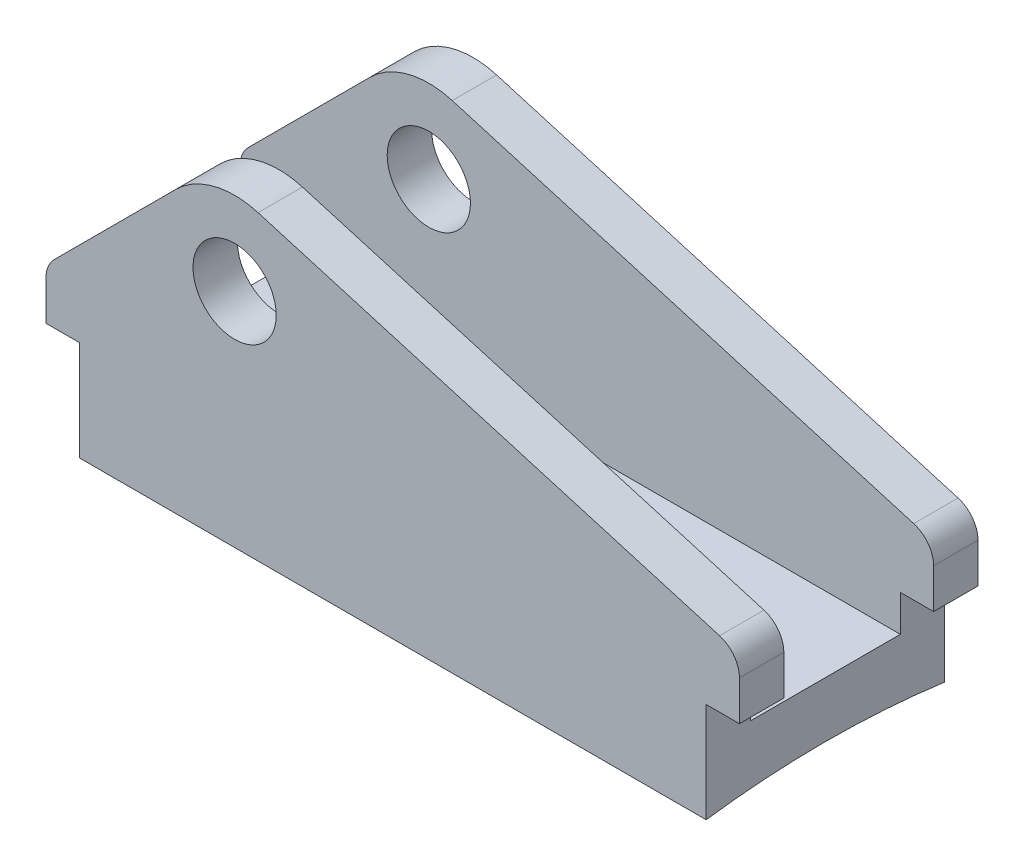
ISO-10303-21;
HEADER;
FILE_DESCRIPTION(('STEP AP214'),'2;1');
FILE_NAME('part.step','',(''),(''),'','','');
FILE_SCHEMA(('AUTOMOTIVE_DESIGN { 1 0 10303 214 1 1 1 1 }'));
ENDSEC;
DATA;
#1=APPLICATION_CONTEXT('core data for automotive mechanical design processes');
#2=APPLICATION_PROTOCOL_DEFINITION('international standard','automotive_design',2000,#1);
#3=PRODUCT_CONTEXT('',#1,'mechanical');
#4=PRODUCT('Part','Part','',(#3));
#5=PRODUCT_RELATED_PRODUCT_CATEGORY('part','',(#4));
#6=PRODUCT_DEFINITION_FORMATION('','',#4);
#7=PRODUCT_DEFINITION_CONTEXT('part definition',#1,'design');
#8=PRODUCT_DEFINITION('design','',#6,#7);
#9=PRODUCT_DEFINITION_SHAPE('','',#8);
#10=(LENGTH_UNIT() NAMED_UNIT(*) SI_UNIT(.MILLI.,.METRE.));
#11=(NAMED_UNIT(*) PLANE_ANGLE_UNIT() SI_UNIT($,.RADIAN.));
#12=(NAMED_UNIT(*) SI_UNIT($,.STERADIAN.) SOLID_ANGLE_UNIT());
#13=UNCERTAINTY_MEASURE_WITH_UNIT(LENGTH_MEASURE(1.E-05),#10,'distance_accuracy_value','');
#14=(GEOMETRIC_REPRESENTATION_CONTEXT(3) GLOBAL_UNCERTAINTY_ASSIGNED_CONTEXT((#13)) GLOBAL_UNIT_ASSIGNED_CONTEXT((#10,
#11,#12)) REPRESENTATION_CONTEXT('',''));
#15=CARTESIAN_POINT('',(0.,0.,0.));
#16=DIRECTION('',(0.,0.,1.));
#17=DIRECTION('',(1.,0.,0.));
#18=AXIS2_PLACEMENT_3D('',#15,#16,#17);
#19=CARTESIAN_POINT('',(56.5,176.548888359395,21.5));
#20=DIRECTION('',(0.,1.,0.));
#21=DIRECTION('',(-1.,0.,0.));
#22=AXIS2_PLACEMENT_3D('',#19,#20,#21);
#23=PLANE('',#22);
#24=DIRECTION('',(0.,0.,-1.));
#25=VECTOR('',#24,1.);
#26=CARTESIAN_POINT('',(62.5,176.548888359395,21.5));
#27=LINE('',#26,#25);
#28=CARTESIAN_POINT('',(62.5,176.548888359395,-13.5));
#29=VERTEX_POINT('',#28);
#30=CARTESIAN_POINT('',(62.5,176.548888359395,-21.5));
#31=VERTEX_POINT('',#30);
#32=EDGE_CURVE('E226',#29,#31,#27,.T.);
#33=ORIENTED_EDGE('',*,*,#32,.F.);
#34=DIRECTION('',(-1.,0.,0.));
#35=VECTOR('',#34,1.);
#36=CARTESIAN_POINT('',(56.5,176.548888359395,-13.5));
#37=LINE('',#36,#35);
#38=CARTESIAN_POINT('',(56.5,176.548888359395,-13.5));
#39=VERTEX_POINT('',#38);
#40=EDGE_CURVE('E266',#29,#39,#37,.T.);
#41=ORIENTED_EDGE('',*,*,#40,.T.);
#42=DIRECTION('',(0.,0.,-1.));
#43=VECTOR('',#42,1.);
#44=CARTESIAN_POINT('',(56.5,176.548888359395,21.5));
#45=LINE('',#44,#43);
#46=CARTESIAN_POINT('',(56.5,176.548888359395,-21.5));
#47=VERTEX_POINT('',#46);
#48=EDGE_CURVE('E229',#39,#47,#45,.T.);
#49=ORIENTED_EDGE('',*,*,#48,.T.);
#50=DIRECTION('',(1.,0.,0.));
#51=VECTOR('',#50,1.);
#52=CARTESIAN_POINT('',(56.5,176.548888359395,-21.5));
#53=LINE('',#52,#51);
#54=EDGE_CURVE('E177',#47,#31,#53,.T.);
#55=ORIENTED_EDGE('',*,*,#54,.T.);
#56=EDGE_LOOP('',(#33,#41,#49,#55));
#57=FACE_BOUND('',#56,.T.);
#58=ADVANCED_FACE('F39',(#57),#23,.F.);
#59=CARTESIAN_POINT('',(62.5,176.548888359395,21.5));
#60=DIRECTION('',(-1.,0.,0.));
#61=DIRECTION('',(0.,-1.,0.));
#62=AXIS2_PLACEMENT_3D('',#59,#60,#61);
#63=PLANE('',#62);
#64=DIRECTION('',(0.,0.,-1.));
#65=VECTOR('',#64,1.);
#66=CARTESIAN_POINT('',(62.5,183.691023983127,21.5));
#67=LINE('',#66,#65);
#68=CARTESIAN_POINT('',(62.5,183.691023983127,-13.5));
#69=VERTEX_POINT('',#68);
#70=CARTESIAN_POINT('',(62.5,183.691023983127,-21.5));
#71=VERTEX_POINT('',#70);
#72=EDGE_CURVE('E225',#69,#71,#67,.T.);
#73=ORIENTED_EDGE('',*,*,#72,.F.);
#74=DIRECTION('',(0.,-1.,0.));
#75=VECTOR('',#74,1.);
#76=CARTESIAN_POINT('',(62.5,176.548888359395,-13.5));
#77=LINE('',#76,#75);
#78=EDGE_CURVE('E366',#69,#29,#77,.T.);
#79=ORIENTED_EDGE('',*,*,#78,.T.);
#80=ORIENTED_EDGE('',*,*,#32,.T.);
#81=DIRECTION('',(0.,1.,0.));
#82=VECTOR('',#81,1.);
#83=CARTESIAN_POINT('',(62.5,176.548888359395,-21.5));
#84=LINE('',#83,#82);
#85=EDGE_CURVE('E176',#31,#71,#84,.T.);
#86=ORIENTED_EDGE('',*,*,#85,.T.);
#87=EDGE_LOOP('',(#73,#79,#80,#86));
#88=FACE_BOUND('',#87,.T.);
#89=ADVANCED_FACE('F381',(#88),#63,.F.);
#90=CARTESIAN_POINT('',(57.5,183.691023983127,21.5));
#91=DIRECTION('',(0.,0.,-1.));
#92=DIRECTION('',(-1.,0.,0.));
#93=AXIS2_PLACEMENT_3D('',#90,#91,#92);
#94=CYLINDRICAL_SURFACE('',#93,5.00000000000001);
#95=DIRECTION('',(0.,0.,-1.));
#96=VECTOR('',#95,1.);
#97=CARTESIAN_POINT('',(58.9101576401027,188.488049668909,21.5));
#98=LINE('',#97,#96);
#99=CARTESIAN_POINT('',(58.9101576401027,188.488049668909,-13.5));
#100=VERTEX_POINT('',#99);
#101=CARTESIAN_POINT('',(58.9101576401027,188.488049668909,-21.5));
#102=VERTEX_POINT('',#101);
#103=EDGE_CURVE('E217',#100,#102,#98,.T.);
#104=ORIENTED_EDGE('',*,*,#103,.F.);
#105=CARTESIAN_POINT('',(57.5,183.691023983127,-13.5));
#106=DIRECTION('',(0.,0.,-1.));
#107=DIRECTION('',(-1.,0.,0.));
#108=AXIS2_PLACEMENT_3D('',#105,#106,#107);
#109=CIRCLE('',#108,5.00000000000001);
#110=EDGE_CURVE('E371',#100,#69,#109,.T.);
#111=ORIENTED_EDGE('',*,*,#110,.T.);
#112=ORIENTED_EDGE('',*,*,#72,.T.);
#113=CARTESIAN_POINT('',(57.5,183.691023983127,-21.5));
#114=DIRECTION('',(0.,0.,1.));
#115=DIRECTION('',(1.,0.,0.));
#116=AXIS2_PLACEMENT_3D('',#113,#114,#115);
#117=CIRCLE('',#116,5.00000000000001);
#118=EDGE_CURVE('E185',#71,#102,#117,.T.);
#119=ORIENTED_EDGE('',*,*,#118,.T.);
#120=EDGE_LOOP('',(#104,#111,#112,#119));
#121=FACE_BOUND('',#120,.T.);
#122=ADVANCED_FACE('F378',(#121),#94,.T.);
#123=CARTESIAN_POINT('',(58.9101576401027,188.488049668909,21.5));
#124=DIRECTION('',(-0.282031528020554,-0.959405137156557,0.));
#125=DIRECTION('',(0.959405137156557,-0.282031528020554,0.));
#126=AXIS2_PLACEMENT_3D('',#123,#124,#125);
#127=PLANE('',#126);
#128=DIRECTION('',(0.,0.,-1.));
#129=VECTOR('',#128,1.);
#130=CARTESIAN_POINT('',(-24.2695270796917,212.939965416744,21.5));
#131=LINE('',#130,#129);
#132=CARTESIAN_POINT('',(-24.2695270796917,212.939965416744,-13.5));
#133=VERTEX_POINT('',#132);
#134=CARTESIAN_POINT('',(-24.2695270796917,212.939965416744,-21.5));
#135=VERTEX_POINT('',#134);
#136=EDGE_CURVE('E212',#133,#135,#131,.T.);
#137=ORIENTED_EDGE('',*,*,#136,.F.);
#138=DIRECTION('',(0.959405137156557,-0.282031528020554,0.));
#139=VECTOR('',#138,1.);
#140=CARTESIAN_POINT('',(58.9101576401027,188.488049668909,-13.5));
#141=LINE('',#140,#139);
#142=EDGE_CURVE('E377',#133,#100,#141,.T.);
#143=ORIENTED_EDGE('',*,*,#142,.T.);
#144=ORIENTED_EDGE('',*,*,#103,.T.);
#145=DIRECTION('',(-0.959405137156557,0.282031528020554,0.));
#146=VECTOR('',#145,1.);
#147=CARTESIAN_POINT('',(58.9101576401027,188.488049668909,-21.5));
#148=LINE('',#147,#146);
#149=EDGE_CURVE('E183',#102,#135,#148,.T.);
#150=ORIENTED_EDGE('',*,*,#149,.T.);
#151=EDGE_LOOP('',(#137,#143,#144,#150));
#152=FACE_BOUND('',#151,.T.);
#153=ADVANCED_FACE('F390',(#152),#127,.F.);
#154=CARTESIAN_POINT('',(-28.5,198.548888359395,21.5));
#155=DIRECTION('',(0.,0.,-1.));
#156=DIRECTION('',(-1.,0.,0.));
#157=AXIS2_PLACEMENT_3D('',#154,#155,#156);
#158=CYLINDRICAL_SURFACE('',#157,15.);
#159=DIRECTION('',(0.,0.,-1.));
#160=VECTOR('',#159,1.);
#161=CARTESIAN_POINT('',(-39.1066017177982,209.155490077194,21.5));
#162=LINE('',#161,#160);
#163=CARTESIAN_POINT('',(-39.1066017177982,209.155490077194,-13.5));
#164=VERTEX_POINT('',#163);
#165=CARTESIAN_POINT('',(-39.1066017177982,209.155490077194,-21.5));
#166=VERTEX_POINT('',#165);
#167=EDGE_CURVE('E209',#164,#166,#162,.T.);
#168=ORIENTED_EDGE('',*,*,#167,.F.);
#169=CARTESIAN_POINT('',(-28.5,198.548888359395,-13.5));
#170=DIRECTION('',(0.,0.,-1.));
#171=DIRECTION('',(-1.,0.,0.));
#172=AXIS2_PLACEMENT_3D('',#169,#170,#171);
#173=CIRCLE('',#172,15.);
#174=EDGE_CURVE('E386',#164,#133,#173,.T.);
#175=ORIENTED_EDGE('',*,*,#174,.T.);
#176=ORIENTED_EDGE('',*,*,#136,.T.);
#177=CARTESIAN_POINT('',(-28.5,198.548888359395,-21.5));
#178=DIRECTION('',(0.,0.,1.));
#179=DIRECTION('',(1.,0.,0.));
#180=AXIS2_PLACEMENT_3D('',#177,#178,#179);
#181=CIRCLE('',#180,15.);
#182=EDGE_CURVE('E187',#135,#166,#181,.T.);
#183=ORIENTED_EDGE('',*,*,#182,.T.);
#184=EDGE_LOOP('',(#168,#175,#176,#183));
#185=FACE_BOUND('',#184,.T.);
#186=ADVANCED_FACE('F470',(#185),#158,.T.);
#187=CARTESIAN_POINT('',(-39.1066017177982,209.155490077194,21.5));
#188=DIRECTION('',(0.707106781186544,-0.707106781186551,0.));
#189=DIRECTION('',(0.707106781186551,0.707106781186544,0.));
#190=AXIS2_PLACEMENT_3D('',#187,#188,#189);
#191=PLANE('',#190);
#192=DIRECTION('',(0.,0.,-1.));
#193=VECTOR('',#192,1.);
#194=CARTESIAN_POINT('',(-61.0355339059328,187.226557889059,21.5));
#195=LINE('',#194,#193);
#196=CARTESIAN_POINT('',(-61.0355339059328,187.226557889059,-13.5));
#197=VERTEX_POINT('',#196);
#198=CARTESIAN_POINT('',(-61.0355339059328,187.226557889059,-21.5));
#199=VERTEX_POINT('',#198);
#200=EDGE_CURVE('E158',#197,#199,#195,.T.);
#201=ORIENTED_EDGE('',*,*,#200,.F.);
#202=DIRECTION('',(0.707106781186551,0.707106781186544,0.));
#203=VECTOR('',#202,1.);
#204=CARTESIAN_POINT('',(-39.1066017177982,209.155490077194,-13.5));
#205=LINE('',#204,#203);
#206=EDGE_CURVE('E391',#197,#164,#205,.T.);
#207=ORIENTED_EDGE('',*,*,#206,.T.);
#208=ORIENTED_EDGE('',*,*,#167,.T.);
#209=DIRECTION('',(-0.707106781186551,-0.707106781186544,0.));
#210=VECTOR('',#209,1.);
#211=CARTESIAN_POINT('',(-39.1066017177982,209.155490077194,-21.5));
#212=LINE('',#211,#210);
#213=EDGE_CURVE('E192',#166,#199,#212,.T.);
#214=ORIENTED_EDGE('',*,*,#213,.T.);
#215=EDGE_LOOP('',(#201,#207,#208,#214));
#216=FACE_BOUND('',#215,.T.);
#217=ADVANCED_FACE('F467',(#216),#191,.F.);
#218=CARTESIAN_POINT('',(-57.5,183.691023983127,21.5));
#219=DIRECTION('',(0.,0.,-1.));
#220=DIRECTION('',(-1.,0.,0.));
#221=AXIS2_PLACEMENT_3D('',#218,#219,#220);
#222=CYLINDRICAL_SURFACE('',#221,4.99999999999999);
#223=DIRECTION('',(0.,0.,-1.));
#224=VECTOR('',#223,1.);
#225=CARTESIAN_POINT('',(-62.5,183.691023983127,21.5));
#226=LINE('',#225,#224);
#227=CARTESIAN_POINT('',(-62.5,183.691023983127,-13.5));
#228=VERTEX_POINT('',#227);
#229=CARTESIAN_POINT('',(-62.5,183.691023983127,-21.5));
#230=VERTEX_POINT('',#229);
#231=EDGE_CURVE('E157',#228,#230,#226,.T.);
#232=ORIENTED_EDGE('',*,*,#231,.F.);
#233=CARTESIAN_POINT('',(-57.5,183.691023983127,-13.5));
#234=DIRECTION('',(0.,0.,-1.));
#235=DIRECTION('',(-1.,0.,0.));
#236=AXIS2_PLACEMENT_3D('',#233,#234,#235);
#237=CIRCLE('',#236,4.99999999999999);
#238=EDGE_CURVE('E458',#228,#197,#237,.T.);
#239=ORIENTED_EDGE('',*,*,#238,.T.);
#240=ORIENTED_EDGE('',*,*,#200,.T.);
#241=CARTESIAN_POINT('',(-57.5,183.691023983127,-21.5));
#242=DIRECTION('',(0.,0.,1.));
#243=DIRECTION('',(1.,0.,0.));
#244=AXIS2_PLACEMENT_3D('',#241,#242,#243);
#245=CIRCLE('',#244,4.99999999999999);
#246=EDGE_CURVE('E191',#199,#230,#245,.T.);
#247=ORIENTED_EDGE('',*,*,#246,.T.);
#248=EDGE_LOOP('',(#232,#239,#240,#247));
#249=FACE_BOUND('',#248,.T.);
#250=ADVANCED_FACE('F475',(#249),#222,.T.);
#251=CARTESIAN_POINT('',(-62.5,183.691023983127,21.5));
#252=DIRECTION('',(1.,0.,0.));
#253=DIRECTION('',(0.,0.,-1.));
#254=AXIS2_PLACEMENT_3D('',#251,#252,#253);
#255=PLANE('',#254);
#256=DIRECTION('',(0.,0.,-1.));
#257=VECTOR('',#256,1.);
#258=CARTESIAN_POINT('',(-62.5,176.548888359395,21.5));
#259=LINE('',#258,#257);
#260=CARTESIAN_POINT('',(-62.5,176.548888359395,-13.5));
#261=VERTEX_POINT('',#260);
#262=CARTESIAN_POINT('',(-62.5,176.548888359395,-21.5));
#263=VERTEX_POINT('',#262);
#264=EDGE_CURVE('E206',#261,#263,#259,.T.);
#265=ORIENTED_EDGE('',*,*,#264,.F.);
#266=DIRECTION('',(0.,1.,0.));
#267=VECTOR('',#266,1.);
#268=CARTESIAN_POINT('',(-62.5,183.691023983127,-13.5));
#269=LINE('',#268,#267);
#270=EDGE_CURVE('E460',#261,#228,#269,.T.);
#271=ORIENTED_EDGE('',*,*,#270,.T.);
#272=ORIENTED_EDGE('',*,*,#231,.T.);
#273=DIRECTION('',(0.,-1.,0.));
#274=VECTOR('',#273,1.);
#275=CARTESIAN_POINT('',(-62.5,183.691023983127,-21.5));
#276=LINE('',#275,#274);
#277=EDGE_CURVE('E197',#230,#263,#276,.T.);
#278=ORIENTED_EDGE('',*,*,#277,.T.);
#279=EDGE_LOOP('',(#265,#271,#272,#278));
#280=FACE_BOUND('',#279,.T.);
#281=ADVANCED_FACE('F413',(#280),#255,.F.);
#282=CARTESIAN_POINT('',(-62.5,176.548888359395,21.5));
#283=DIRECTION('',(0.,1.,0.));
#284=DIRECTION('',(0.,0.,1.));
#285=AXIS2_PLACEMENT_3D('',#282,#283,#284);
#286=PLANE('',#285);
#287=DIRECTION('',(0.,0.,-1.));
#288=VECTOR('',#287,1.);
#289=CARTESIAN_POINT('',(-56.5,176.548888359395,21.5));
#290=LINE('',#289,#288);
#291=CARTESIAN_POINT('',(-56.5,176.548888359395,-13.5));
#292=VERTEX_POINT('',#291);
#293=CARTESIAN_POINT('',(-56.5,176.548888359395,-21.5));
#294=VERTEX_POINT('',#293);
#295=EDGE_CURVE('E106',#292,#294,#290,.T.);
#296=ORIENTED_EDGE('',*,*,#295,.F.);
#297=DIRECTION('',(-1.,0.,0.));
#298=VECTOR('',#297,1.);
#299=CARTESIAN_POINT('',(-62.5,176.548888359395,-13.5));
#300=LINE('',#299,#298);
#301=EDGE_CURVE('E241',#292,#261,#300,.T.);
#302=ORIENTED_EDGE('',*,*,#301,.T.);
#303=ORIENTED_EDGE('',*,*,#264,.T.);
#304=DIRECTION('',(1.,0.,0.));
#305=VECTOR('',#304,1.);
#306=CARTESIAN_POINT('',(-62.5,176.548888359395,-21.5));
#307=LINE('',#306,#305);
#308=EDGE_CURVE('E199',#263,#294,#307,.T.);
#309=ORIENTED_EDGE('',*,*,#308,.T.);
#310=EDGE_LOOP('',(#296,#302,#303,#309));
#311=FACE_BOUND('',#310,.T.);
#312=ADVANCED_FACE('F406',(#311),#286,.F.);
#313=CARTESIAN_POINT('',(-28.5,198.548888359395,21.5));
#314=DIRECTION('',(0.,0.,-1.));
#315=DIRECTION('',(-1.,0.,0.));
#316=AXIS2_PLACEMENT_3D('',#313,#314,#315);
#317=CYLINDRICAL_SURFACE('',#316,7.50000000000001);
#318=CARTESIAN_POINT('',(-28.5,198.548888359395,-13.5));
#319=DIRECTION('',(0.,0.,-1.));
#320=DIRECTION('',(-1.,0.,0.));
#321=AXIS2_PLACEMENT_3D('',#318,#319,#320);
#322=CIRCLE('',#321,7.50000000000001);
#323=CARTESIAN_POINT('',(-36.0000000000001,198.548888359395,-13.5));
#324=VERTEX_POINT('',#323);
#325=EDGE_CURVE('E239',#324,#324,#322,.T.);
#326=ORIENTED_EDGE('',*,*,#325,.F.);
#327=EDGE_LOOP('',(#326));
#328=FACE_BOUND('',#327,.T.);
#329=CARTESIAN_POINT('',(-28.5,198.548888359395,-21.5));
#330=DIRECTION('',(0.,0.,1.));
#331=DIRECTION('',(1.,0.,0.));
#332=AXIS2_PLACEMENT_3D('',#329,#330,#331);
#333=CIRCLE('',#332,7.50000000000001);
#334=CARTESIAN_POINT('',(-21.,198.548888359395,-21.5));
#335=VERTEX_POINT('',#334);
#336=EDGE_CURVE('E292',#335,#335,#333,.T.);
#337=ORIENTED_EDGE('',*,*,#336,.F.);
#338=EDGE_LOOP('',(#337));
#339=FACE_BOUND('',#338,.T.);
#340=ADVANCED_FACE('F404',(#328,#339),#317,.F.);
#341=CARTESIAN_POINT('',(57.5,183.691023983127,21.5));
#342=DIRECTION('',(0.,0.,1.));
#343=DIRECTION('',(1.,0.,0.));
#344=AXIS2_PLACEMENT_3D('',#341,#342,#343);
#345=PLANE('',#344);
#346=DIRECTION('',(0.,-1.,0.));
#347=VECTOR('',#346,1.);
#348=CARTESIAN_POINT('',(-56.5,176.548888359395,21.5));
#349=LINE('',#348,#347);
#350=CARTESIAN_POINT('',(-56.5,176.548888359395,21.5));
#351=VERTEX_POINT('',#350);
#352=CARTESIAN_POINT('',(-56.5,158.548888359395,21.5));
#353=VERTEX_POINT('',#352);
#354=EDGE_CURVE('E205',#351,#353,#349,.T.);
#355=ORIENTED_EDGE('',*,*,#354,.T.);
#356=DIRECTION('',(1.,0.,0.));
#357=VECTOR('',#356,1.);
#358=CARTESIAN_POINT('',(-56.5,158.548888359395,21.5));
#359=LINE('',#358,#357);
#360=CARTESIAN_POINT('',(56.5,158.548888359395,21.5));
#361=VERTEX_POINT('',#360);
#362=EDGE_CURVE('E281',#353,#361,#359,.T.);
#363=ORIENTED_EDGE('',*,*,#362,.T.);
#364=DIRECTION('',(0.,1.,0.));
#365=VECTOR('',#364,1.);
#366=CARTESIAN_POINT('',(56.5,158.548888359395,21.5));
#367=LINE('',#366,#365);
#368=CARTESIAN_POINT('',(56.5,176.548888359395,21.5));
#369=VERTEX_POINT('',#368);
#370=EDGE_CURVE('E111',#361,#369,#367,.T.);
#371=ORIENTED_EDGE('',*,*,#370,.T.);
#372=DIRECTION('',(1.,0.,0.));
#373=VECTOR('',#372,1.);
#374=CARTESIAN_POINT('',(56.5,176.548888359395,21.5));
#375=LINE('',#374,#373);
#376=CARTESIAN_POINT('',(62.5,176.548888359395,21.5));
#377=VERTEX_POINT('',#376);
#378=EDGE_CURVE('E293',#369,#377,#375,.T.);
#379=ORIENTED_EDGE('',*,*,#378,.T.);
#380=DIRECTION('',(0.,1.,0.));
#381=VECTOR('',#380,1.);
#382=CARTESIAN_POINT('',(62.5,176.548888359395,21.5));
#383=LINE('',#382,#381);
#384=CARTESIAN_POINT('',(62.5,183.691023983127,21.5));
#385=VERTEX_POINT('',#384);
#386=EDGE_CURVE('E300',#377,#385,#383,.T.);
#387=ORIENTED_EDGE('',*,*,#386,.T.);
#388=CARTESIAN_POINT('',(57.5,183.691023983127,21.5));
#389=DIRECTION('',(0.,0.,1.));
#390=DIRECTION('',(1.,0.,0.));
#391=AXIS2_PLACEMENT_3D('',#388,#389,#390);
#392=CIRCLE('',#391,5.00000000000001);
#393=CARTESIAN_POINT('',(58.9101576401027,188.488049668909,21.5));
#394=VERTEX_POINT('',#393);
#395=EDGE_CURVE('E298',#385,#394,#392,.T.);
#396=ORIENTED_EDGE('',*,*,#395,.T.);
#397=DIRECTION('',(-0.959405137156557,0.282031528020554,0.));
#398=VECTOR('',#397,1.);
#399=CARTESIAN_POINT('',(58.9101576401027,188.488049668909,21.5));
#400=LINE('',#399,#398);
#401=CARTESIAN_POINT('',(-24.2695270796917,212.939965416744,21.5));
#402=VERTEX_POINT('',#401);
#403=EDGE_CURVE('E302',#394,#402,#400,.T.);
#404=ORIENTED_EDGE('',*,*,#403,.T.);
#405=CARTESIAN_POINT('',(-28.5,198.548888359395,21.5));
#406=DIRECTION('',(0.,0.,1.));
#407=DIRECTION('',(1.,0.,0.));
#408=AXIS2_PLACEMENT_3D('',#405,#406,#407);
#409=CIRCLE('',#408,15.);
#410=CARTESIAN_POINT('',(-39.1066017177982,209.155490077194,21.5));
#411=VERTEX_POINT('',#410);
#412=EDGE_CURVE('E305',#402,#411,#409,.T.);
#413=ORIENTED_EDGE('',*,*,#412,.T.);
#414=DIRECTION('',(-0.707106781186551,-0.707106781186544,0.));
#415=VECTOR('',#414,1.);
#416=CARTESIAN_POINT('',(-39.1066017177982,209.155490077194,21.5));
#417=LINE('',#416,#415);
#418=CARTESIAN_POINT('',(-61.0355339059328,187.226557889059,21.5));
#419=VERTEX_POINT('',#418);
#420=EDGE_CURVE('E145',#411,#419,#417,.T.);
#421=ORIENTED_EDGE('',*,*,#420,.T.);
#422=CARTESIAN_POINT('',(-57.5,183.691023983127,21.5));
#423=DIRECTION('',(0.,0.,1.));
#424=DIRECTION('',(1.,0.,0.));
#425=AXIS2_PLACEMENT_3D('',#422,#423,#424);
#426=CIRCLE('',#425,4.99999999999999);
#427=CARTESIAN_POINT('',(-62.5,183.691023983127,21.5));
#428=VERTEX_POINT('',#427);
#429=EDGE_CURVE('E137',#419,#428,#426,.T.);
#430=ORIENTED_EDGE('',*,*,#429,.T.);
#431=DIRECTION('',(0.,-1.,0.));
#432=VECTOR('',#431,1.);
#433=CARTESIAN_POINT('',(-62.5,183.691023983127,21.5));
#434=LINE('',#433,#432);
#435=CARTESIAN_POINT('',(-62.5,176.548888359395,21.5));
#436=VERTEX_POINT('',#435);
#437=EDGE_CURVE('E143',#428,#436,#434,.T.);
#438=ORIENTED_EDGE('',*,*,#437,.T.);
#439=DIRECTION('',(1.,0.,0.));
#440=VECTOR('',#439,1.);
#441=CARTESIAN_POINT('',(-62.5,176.548888359395,21.5));
#442=LINE('',#441,#440);
#443=EDGE_CURVE('E62',#436,#351,#442,.T.);
#444=ORIENTED_EDGE('',*,*,#443,.T.);
#445=EDGE_LOOP('',(#355,#363,#371,#379,#387,#396,#404,#413,#421,#430,#438,#444));
#446=FACE_BOUND('',#445,.T.);
#447=CARTESIAN_POINT('',(-28.5,198.548888359395,21.5));
#448=DIRECTION('',(0.,0.,1.));
#449=DIRECTION('',(1.,0.,0.));
#450=AXIS2_PLACEMENT_3D('',#447,#448,#449);
#451=CIRCLE('',#450,7.50000000000001);
#452=CARTESIAN_POINT('',(-21.,198.548888359395,21.5));
#453=VERTEX_POINT('',#452);
#454=EDGE_CURVE('E171',#453,#453,#451,.T.);
#455=ORIENTED_EDGE('',*,*,#454,.F.);
#456=EDGE_LOOP('',(#455));
#457=FACE_BOUND('',#456,.T.);
#458=ADVANCED_FACE('F140',(#446,#457),#345,.T.);
#459=CARTESIAN_POINT('',(57.5,183.691023983127,-21.5));
#460=DIRECTION('',(0.,0.,1.));
#461=DIRECTION('',(1.,0.,0.));
#462=AXIS2_PLACEMENT_3D('',#459,#460,#461);
#463=PLANE('',#462);
#464=DIRECTION('',(0.,-1.,0.));
#465=VECTOR('',#464,1.);
#466=CARTESIAN_POINT('',(-56.5,176.548888359395,-21.5));
#467=LINE('',#466,#465);
#468=CARTESIAN_POINT('',(-56.5,158.548888359395,-21.5));
#469=VERTEX_POINT('',#468);
#470=EDGE_CURVE('E169',#294,#469,#467,.T.);
#471=ORIENTED_EDGE('',*,*,#470,.F.);
#472=ORIENTED_EDGE('',*,*,#308,.F.);
#473=ORIENTED_EDGE('',*,*,#277,.F.);
#474=ORIENTED_EDGE('',*,*,#246,.F.);
#475=ORIENTED_EDGE('',*,*,#213,.F.);
#476=ORIENTED_EDGE('',*,*,#182,.F.);
#477=ORIENTED_EDGE('',*,*,#149,.F.);
#478=ORIENTED_EDGE('',*,*,#118,.F.);
#479=ORIENTED_EDGE('',*,*,#85,.F.);
#480=ORIENTED_EDGE('',*,*,#54,.F.);
#481=DIRECTION('',(0.,1.,0.));
#482=VECTOR('',#481,1.);
#483=CARTESIAN_POINT('',(56.5,158.548888359395,-21.5));
#484=LINE('',#483,#482);
#485=CARTESIAN_POINT('',(56.5,158.548888359395,-21.5));
#486=VERTEX_POINT('',#485);
#487=EDGE_CURVE('E172',#486,#47,#484,.T.);
#488=ORIENTED_EDGE('',*,*,#487,.F.);
#489=DIRECTION('',(1.,0.,0.));
#490=VECTOR('',#489,1.);
#491=CARTESIAN_POINT('',(-56.5,158.548888359395,-21.5));
#492=LINE('',#491,#490);
#493=EDGE_CURVE('E168',#469,#486,#492,.T.);
#494=ORIENTED_EDGE('',*,*,#493,.F.);
#495=EDGE_LOOP('',(#471,#472,#473,#474,#475,#476,#477,#478,#479,#480,#488,#494));
#496=FACE_BOUND('',#495,.T.);
#497=ORIENTED_EDGE('',*,*,#336,.T.);
#498=EDGE_LOOP('',(#497));
#499=FACE_BOUND('',#498,.T.);
#500=ADVANCED_FACE('F254',(#496,#499),#463,.F.);
#501=CARTESIAN_POINT('',(-56.5,176.548888359395,21.5));
#502=DIRECTION('',(1.,0.,0.));
#503=DIRECTION('',(0.,1.,0.));
#504=AXIS2_PLACEMENT_3D('',#501,#502,#503);
#505=PLANE('',#504);
#506=DIRECTION('',(0.,0.,-1.));
#507=VECTOR('',#506,1.);
#508=CARTESIAN_POINT('',(-56.5,170.,21.5));
#509=LINE('',#508,#507);
#510=CARTESIAN_POINT('',(-56.5,170.,13.5));
#511=VERTEX_POINT('',#510);
#512=CARTESIAN_POINT('',(-56.5,170.,-13.5));
#513=VERTEX_POINT('',#512);
#514=EDGE_CURVE('E287',#511,#513,#509,.T.);
#515=ORIENTED_EDGE('',*,*,#514,.T.);
#516=DIRECTION('',(0.,1.,0.));
#517=VECTOR('',#516,1.);
#518=CARTESIAN_POINT('',(-56.5,176.548888359395,-13.5));
#519=LINE('',#518,#517);
#520=EDGE_CURVE('E289',#513,#292,#519,.T.);
#521=ORIENTED_EDGE('',*,*,#520,.T.);
#522=ORIENTED_EDGE('',*,*,#295,.T.);
#523=ORIENTED_EDGE('',*,*,#470,.T.);
#524=CARTESIAN_POINT('',(-56.5000000000002,0.,0.));
#525=DIRECTION('',(1.,0.,0.));
#526=DIRECTION('',(0.,1.,0.));
#527=AXIS2_PLACEMENT_3D('',#524,#525,#526);
#528=CIRCLE('',#527,160.);
#529=EDGE_CURVE('E278',#469,#353,#528,.T.);
#530=ORIENTED_EDGE('',*,*,#529,.T.);
#531=ORIENTED_EDGE('',*,*,#354,.F.);
#532=CARTESIAN_POINT('',(-56.5,176.548888359395,13.5));
#533=VERTEX_POINT('',#532);
#534=EDGE_CURVE('E201',#351,#533,#290,.T.);
#535=ORIENTED_EDGE('',*,*,#534,.T.);
#536=DIRECTION('',(0.,-1.,0.));
#537=VECTOR('',#536,1.);
#538=CARTESIAN_POINT('',(-56.5,176.548888359395,13.5));
#539=LINE('',#538,#537);
#540=EDGE_CURVE('E53',#533,#511,#539,.T.);
#541=ORIENTED_EDGE('',*,*,#540,.T.);
#542=EDGE_LOOP('',(#515,#521,#522,#523,#530,#531,#535,#541));
#543=FACE_BOUND('',#542,.T.);
#544=ADVANCED_FACE('F41',(#543),#505,.F.);
#545=CARTESIAN_POINT('',(56.5,158.548888359395,21.5));
#546=DIRECTION('',(-1.,0.,0.));
#547=DIRECTION('',(0.,-1.,0.));
#548=AXIS2_PLACEMENT_3D('',#545,#546,#547);
#549=PLANE('',#548);
#550=ORIENTED_EDGE('',*,*,#48,.F.);
#551=DIRECTION('',(0.,-1.,0.));
#552=VECTOR('',#551,1.);
#553=CARTESIAN_POINT('',(56.5,158.548888359395,-13.5));
#554=LINE('',#553,#552);
#555=CARTESIAN_POINT('',(56.5,170.,-13.5));
#556=VERTEX_POINT('',#555);
#557=EDGE_CURVE('E269',#39,#556,#554,.T.);
#558=ORIENTED_EDGE('',*,*,#557,.T.);
#559=DIRECTION('',(0.,0.,1.));
#560=VECTOR('',#559,1.);
#561=CARTESIAN_POINT('',(56.5,170.,21.5));
#562=LINE('',#561,#560);
#563=CARTESIAN_POINT('',(56.5,170.,13.5));
#564=VERTEX_POINT('',#563);
#565=EDGE_CURVE('E11',#556,#564,#562,.T.);
#566=ORIENTED_EDGE('',*,*,#565,.T.);
#567=DIRECTION('',(0.,1.,0.));
#568=VECTOR('',#567,1.);
#569=CARTESIAN_POINT('',(56.5,158.548888359395,13.5));
#570=LINE('',#569,#568);
#571=CARTESIAN_POINT('',(56.5,176.548888359395,13.5));
#572=VERTEX_POINT('',#571);
#573=EDGE_CURVE('E446',#564,#572,#570,.T.);
#574=ORIENTED_EDGE('',*,*,#573,.T.);
#575=EDGE_CURVE('E232',#369,#572,#45,.T.);
#576=ORIENTED_EDGE('',*,*,#575,.F.);
#577=ORIENTED_EDGE('',*,*,#370,.F.);
#578=CARTESIAN_POINT('',(56.5000000000008,0.,0.));
#579=DIRECTION('',(-1.,0.,0.));
#580=DIRECTION('',(0.,-1.,0.));
#581=AXIS2_PLACEMENT_3D('',#578,#579,#580);
#582=CIRCLE('',#581,160.);
#583=EDGE_CURVE('E50',#361,#486,#582,.T.);
#584=ORIENTED_EDGE('',*,*,#583,.T.);
#585=ORIENTED_EDGE('',*,*,#487,.T.);
#586=EDGE_LOOP('',(#550,#558,#566,#574,#576,#577,#584,#585));
#587=FACE_BOUND('',#586,.T.);
#588=ADVANCED_FACE('F249',(#587),#549,.F.);
#589=ORIENTED_EDGE('',*,*,#575,.T.);
#590=DIRECTION('',(1.,0.,0.));
#591=VECTOR('',#590,1.);
#592=CARTESIAN_POINT('',(56.5,176.548888359395,13.5));
#593=LINE('',#592,#591);
#594=CARTESIAN_POINT('',(62.5,176.548888359395,13.5));
#595=VERTEX_POINT('',#594);
#596=EDGE_CURVE('E444',#572,#595,#593,.T.);
#597=ORIENTED_EDGE('',*,*,#596,.T.);
#598=EDGE_CURVE('E230',#377,#595,#27,.T.);
#599=ORIENTED_EDGE('',*,*,#598,.F.);
#600=ORIENTED_EDGE('',*,*,#378,.F.);
#601=EDGE_LOOP('',(#589,#597,#599,#600));
#602=FACE_BOUND('',#601,.T.);
#603=ADVANCED_FACE('F426',(#602),#23,.F.);
#604=ORIENTED_EDGE('',*,*,#598,.T.);
#605=DIRECTION('',(0.,1.,0.));
#606=VECTOR('',#605,1.);
#607=CARTESIAN_POINT('',(62.5,176.548888359395,13.5));
#608=LINE('',#607,#606);
#609=CARTESIAN_POINT('',(62.5,183.691023983127,13.5));
#610=VERTEX_POINT('',#609);
#611=EDGE_CURVE('E452',#595,#610,#608,.T.);
#612=ORIENTED_EDGE('',*,*,#611,.T.);
#613=EDGE_CURVE('E224',#385,#610,#67,.T.);
#614=ORIENTED_EDGE('',*,*,#613,.F.);
#615=ORIENTED_EDGE('',*,*,#386,.F.);
#616=EDGE_LOOP('',(#604,#612,#614,#615));
#617=FACE_BOUND('',#616,.T.);
#618=ADVANCED_FACE('F431',(#617),#63,.F.);
#619=ORIENTED_EDGE('',*,*,#613,.T.);
#620=CARTESIAN_POINT('',(57.5,183.691023983127,13.5));
#621=DIRECTION('',(0.,0.,1.));
#622=DIRECTION('',(1.,0.,0.));
#623=AXIS2_PLACEMENT_3D('',#620,#621,#622);
#624=CIRCLE('',#623,5.00000000000001);
#625=CARTESIAN_POINT('',(58.9101576401027,188.488049668909,13.5));
#626=VERTEX_POINT('',#625);
#627=EDGE_CURVE('E497',#610,#626,#624,.T.);
#628=ORIENTED_EDGE('',*,*,#627,.T.);
#629=EDGE_CURVE('E218',#394,#626,#98,.T.);
#630=ORIENTED_EDGE('',*,*,#629,.F.);
#631=ORIENTED_EDGE('',*,*,#395,.F.);
#632=EDGE_LOOP('',(#619,#628,#630,#631));
#633=FACE_BOUND('',#632,.T.);
#634=ADVANCED_FACE('F437',(#633),#94,.T.);
#635=ORIENTED_EDGE('',*,*,#629,.T.);
#636=DIRECTION('',(-0.959405137156557,0.282031528020554,0.));
#637=VECTOR('',#636,1.);
#638=CARTESIAN_POINT('',(58.9101576401027,188.488049668909,13.5));
#639=LINE('',#638,#637);
#640=CARTESIAN_POINT('',(-24.2695270796917,212.939965416744,13.5));
#641=VERTEX_POINT('',#640);
#642=EDGE_CURVE('E492',#626,#641,#639,.T.);
#643=ORIENTED_EDGE('',*,*,#642,.T.);
#644=EDGE_CURVE('E214',#402,#641,#131,.T.);
#645=ORIENTED_EDGE('',*,*,#644,.F.);
#646=ORIENTED_EDGE('',*,*,#403,.F.);
#647=EDGE_LOOP('',(#635,#643,#645,#646));
#648=FACE_BOUND('',#647,.T.);
#649=ADVANCED_FACE('F504',(#648),#127,.F.);
#650=ORIENTED_EDGE('',*,*,#644,.T.);
#651=CARTESIAN_POINT('',(-28.5,198.548888359395,13.5));
#652=DIRECTION('',(0.,0.,1.));
#653=DIRECTION('',(1.,0.,0.));
#654=AXIS2_PLACEMENT_3D('',#651,#652,#653);
#655=CIRCLE('',#654,15.);
#656=CARTESIAN_POINT('',(-39.1066017177982,209.155490077194,13.5));
#657=VERTEX_POINT('',#656);
#658=EDGE_CURVE('E311',#641,#657,#655,.T.);
#659=ORIENTED_EDGE('',*,*,#658,.T.);
#660=EDGE_CURVE('E211',#411,#657,#162,.T.);
#661=ORIENTED_EDGE('',*,*,#660,.F.);
#662=ORIENTED_EDGE('',*,*,#412,.F.);
#663=EDGE_LOOP('',(#650,#659,#661,#662));
#664=FACE_BOUND('',#663,.T.);
#665=ADVANCED_FACE('F309',(#664),#158,.T.);
#666=ORIENTED_EDGE('',*,*,#660,.T.);
#667=DIRECTION('',(-0.707106781186551,-0.707106781186544,0.));
#668=VECTOR('',#667,1.);
#669=CARTESIAN_POINT('',(-39.1066017177982,209.155490077194,13.5));
#670=LINE('',#669,#668);
#671=CARTESIAN_POINT('',(-61.0355339059328,187.226557889059,13.5));
#672=VERTEX_POINT('',#671);
#673=EDGE_CURVE('E317',#657,#672,#670,.T.);
#674=ORIENTED_EDGE('',*,*,#673,.T.);
#675=EDGE_CURVE('E208',#419,#672,#195,.T.);
#676=ORIENTED_EDGE('',*,*,#675,.F.);
#677=ORIENTED_EDGE('',*,*,#420,.F.);
#678=EDGE_LOOP('',(#666,#674,#676,#677));
#679=FACE_BOUND('',#678,.T.);
#680=ADVANCED_FACE('F316',(#679),#191,.F.);
#681=ORIENTED_EDGE('',*,*,#675,.T.);
#682=CARTESIAN_POINT('',(-57.5,183.691023983127,13.5));
#683=DIRECTION('',(0.,0.,1.));
#684=DIRECTION('',(1.,0.,0.));
#685=AXIS2_PLACEMENT_3D('',#682,#683,#684);
#686=CIRCLE('',#685,4.99999999999999);
#687=CARTESIAN_POINT('',(-62.5,183.691023983127,13.5));
#688=VERTEX_POINT('',#687);
#689=EDGE_CURVE('E154',#672,#688,#686,.T.);
#690=ORIENTED_EDGE('',*,*,#689,.T.);
#691=EDGE_CURVE('E151',#428,#688,#226,.T.);
#692=ORIENTED_EDGE('',*,*,#691,.F.);
#693=ORIENTED_EDGE('',*,*,#429,.F.);
#694=EDGE_LOOP('',(#681,#690,#692,#693));
#695=FACE_BOUND('',#694,.T.);
#696=ADVANCED_FACE('F155',(#695),#222,.T.);
#697=ORIENTED_EDGE('',*,*,#691,.T.);
#698=DIRECTION('',(0.,-1.,0.));
#699=VECTOR('',#698,1.);
#700=CARTESIAN_POINT('',(-62.5,183.691023983127,13.5));
#701=LINE('',#700,#699);
#702=CARTESIAN_POINT('',(-62.5,176.548888359395,13.5));
#703=VERTEX_POINT('',#702);
#704=EDGE_CURVE('E488',#688,#703,#701,.T.);
#705=ORIENTED_EDGE('',*,*,#704,.T.);
#706=EDGE_CURVE('E162',#436,#703,#259,.T.);
#707=ORIENTED_EDGE('',*,*,#706,.F.);
#708=ORIENTED_EDGE('',*,*,#437,.F.);
#709=EDGE_LOOP('',(#697,#705,#707,#708));
#710=FACE_BOUND('',#709,.T.);
#711=ADVANCED_FACE('F161',(#710),#255,.F.);
#712=ORIENTED_EDGE('',*,*,#706,.T.);
#713=DIRECTION('',(1.,0.,0.));
#714=VECTOR('',#713,1.);
#715=CARTESIAN_POINT('',(-62.5,176.548888359395,13.5));
#716=LINE('',#715,#714);
#717=EDGE_CURVE('E240',#703,#533,#716,.T.);
#718=ORIENTED_EDGE('',*,*,#717,.T.);
#719=ORIENTED_EDGE('',*,*,#534,.F.);
#720=ORIENTED_EDGE('',*,*,#443,.F.);
#721=EDGE_LOOP('',(#712,#718,#719,#720));
#722=FACE_BOUND('',#721,.T.);
#723=ADVANCED_FACE('F416',(#722),#286,.F.);
#724=CARTESIAN_POINT('',(-28.5,198.548888359395,13.5));
#725=DIRECTION('',(0.,0.,1.));
#726=DIRECTION('',(1.,0.,0.));
#727=AXIS2_PLACEMENT_3D('',#724,#725,#726);
#728=CIRCLE('',#727,7.50000000000001);
#729=CARTESIAN_POINT('',(-21.,198.548888359395,13.5));
#730=VERTEX_POINT('',#729);
#731=EDGE_CURVE('E231',#730,#730,#728,.T.);
#732=ORIENTED_EDGE('',*,*,#731,.F.);
#733=EDGE_LOOP('',(#732));
#734=FACE_BOUND('',#733,.T.);
#735=ORIENTED_EDGE('',*,*,#454,.T.);
#736=EDGE_LOOP('',(#735));
#737=FACE_BOUND('',#736,.T.);
#738=ADVANCED_FACE('F408',(#734,#737),#317,.F.);
#739=CARTESIAN_POINT('',(-63.,170.,0.));
#740=DIRECTION('',(0.,-1.,0.));
#741=DIRECTION('',(0.,0.,-1.));
#742=AXIS2_PLACEMENT_3D('',#739,#740,#741);
#743=PLANE('',#742);
#744=DIRECTION('',(1.,0.,0.));
#745=VECTOR('',#744,1.);
#746=CARTESIAN_POINT('',(-63.,170.,13.5));
#747=LINE('',#746,#745);
#748=EDGE_CURVE('E481',#511,#564,#747,.T.);
#749=ORIENTED_EDGE('',*,*,#748,.T.);
#750=ORIENTED_EDGE('',*,*,#565,.F.);
#751=DIRECTION('',(1.,0.,0.));
#752=VECTOR('',#751,1.);
#753=CARTESIAN_POINT('',(-63.,170.,-13.5));
#754=LINE('',#753,#752);
#755=EDGE_CURVE('E236',#513,#556,#754,.T.);
#756=ORIENTED_EDGE('',*,*,#755,.F.);
#757=ORIENTED_EDGE('',*,*,#514,.F.);
#758=EDGE_LOOP('',(#749,#750,#756,#757));
#759=FACE_BOUND('',#758,.T.);
#760=ADVANCED_FACE('F425',(#759),#743,.F.);
#761=CARTESIAN_POINT('',(-63.,0.,-13.5));
#762=DIRECTION('',(0.,0.,-1.));
#763=DIRECTION('',(-1.,0.,0.));
#764=AXIS2_PLACEMENT_3D('',#761,#762,#763);
#765=PLANE('',#764);
#766=ORIENTED_EDGE('',*,*,#325,.T.);
#767=EDGE_LOOP('',(#766));
#768=FACE_BOUND('',#767,.T.);
#769=ORIENTED_EDGE('',*,*,#755,.T.);
#770=ORIENTED_EDGE('',*,*,#557,.F.);
#771=ORIENTED_EDGE('',*,*,#40,.F.);
#772=ORIENTED_EDGE('',*,*,#78,.F.);
#773=ORIENTED_EDGE('',*,*,#110,.F.);
#774=ORIENTED_EDGE('',*,*,#142,.F.);
#775=ORIENTED_EDGE('',*,*,#174,.F.);
#776=ORIENTED_EDGE('',*,*,#206,.F.);
#777=ORIENTED_EDGE('',*,*,#238,.F.);
#778=ORIENTED_EDGE('',*,*,#270,.F.);
#779=ORIENTED_EDGE('',*,*,#301,.F.);
#780=ORIENTED_EDGE('',*,*,#520,.F.);
#781=EDGE_LOOP('',(#769,#770,#771,#772,#773,#774,#775,#776,#777,#778,#779,#780));
#782=FACE_BOUND('',#781,.T.);
#783=ADVANCED_FACE('F367',(#768,#782),#765,.F.);
#784=CARTESIAN_POINT('',(-63.,0.,13.5));
#785=DIRECTION('',(0.,0.,1.));
#786=DIRECTION('',(1.,0.,0.));
#787=AXIS2_PLACEMENT_3D('',#784,#785,#786);
#788=PLANE('',#787);
#789=ORIENTED_EDGE('',*,*,#731,.T.);
#790=EDGE_LOOP('',(#789));
#791=FACE_BOUND('',#790,.T.);
#792=ORIENTED_EDGE('',*,*,#717,.F.);
#793=ORIENTED_EDGE('',*,*,#704,.F.);
#794=ORIENTED_EDGE('',*,*,#689,.F.);
#795=ORIENTED_EDGE('',*,*,#673,.F.);
#796=ORIENTED_EDGE('',*,*,#658,.F.);
#797=ORIENTED_EDGE('',*,*,#642,.F.);
#798=ORIENTED_EDGE('',*,*,#627,.F.);
#799=ORIENTED_EDGE('',*,*,#611,.F.);
#800=ORIENTED_EDGE('',*,*,#596,.F.);
#801=ORIENTED_EDGE('',*,*,#573,.F.);
#802=ORIENTED_EDGE('',*,*,#748,.F.);
#803=ORIENTED_EDGE('',*,*,#540,.F.);
#804=EDGE_LOOP('',(#792,#793,#794,#795,#796,#797,#798,#799,#800,#801,#802,#803));
#805=FACE_BOUND('',#804,.T.);
#806=ADVANCED_FACE('F483',(#791,#805),#788,.F.);
#807=CARTESIAN_POINT('',(-63.,0.,0.));
#808=DIRECTION('',(1.,0.,0.));
#809=DIRECTION('',(0.,0.,-1.));
#810=AXIS2_PLACEMENT_3D('',#807,#808,#809);
#811=CYLINDRICAL_SURFACE('',#810,160.);
#812=ORIENTED_EDGE('',*,*,#493,.T.);
#813=ORIENTED_EDGE('',*,*,#583,.F.);
#814=ORIENTED_EDGE('',*,*,#362,.F.);
#815=ORIENTED_EDGE('',*,*,#529,.F.);
#816=EDGE_LOOP('',(#812,#813,#814,#815));
#817=FACE_BOUND('',#816,.T.);
#818=ADVANCED_FACE('F285',(#817),#811,.F.);
#819=CLOSED_SHELL('',(#58,#89,#122,#153,#186,#217,#250,#281,#312,#340,#458,#500,#544,#588,#603,
#618,#634,#649,#665,#680,#696,#711,#723,#738,#760,#783,#806,#818));
#820=MANIFOLD_SOLID_BREP('B2',#819);
#821=ADVANCED_BREP_SHAPE_REPRESENTATION('',(#18,#820),#14);
#822=SHAPE_DEFINITION_REPRESENTATION(#9,#821);
ENDSEC;
END-ISO-10303-21;
